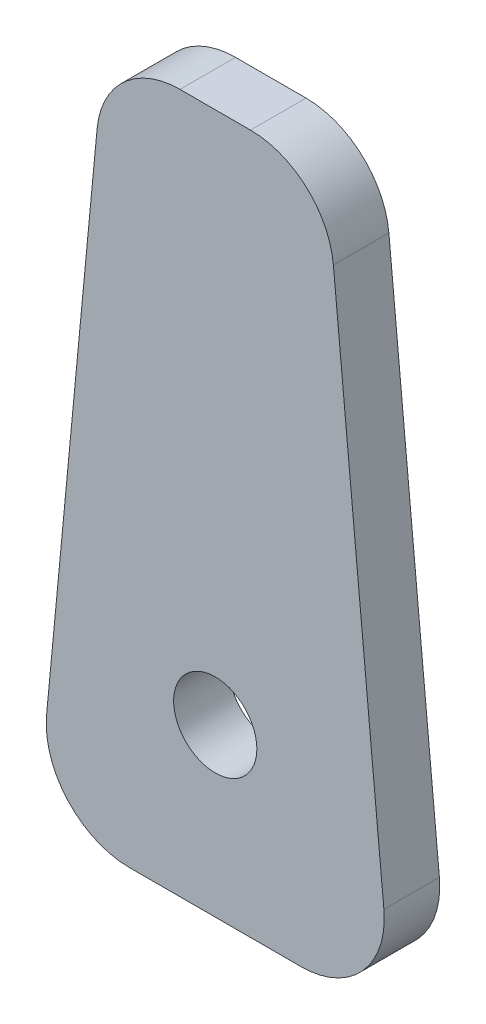
ISO-10303-21;
HEADER;
FILE_DESCRIPTION(('STEP AP214'),'2;1');
FILE_NAME('part.step','',(''),(''),'','','');
FILE_SCHEMA(('AUTOMOTIVE_DESIGN { 1 0 10303 214 1 1 1 1 }'));
ENDSEC;
DATA;
#1=APPLICATION_CONTEXT('core data for automotive mechanical design processes');
#2=APPLICATION_PROTOCOL_DEFINITION('international standard','automotive_design',2000,#1);
#3=PRODUCT_CONTEXT('',#1,'mechanical');
#4=PRODUCT('Part','Part','',(#3));
#5=PRODUCT_RELATED_PRODUCT_CATEGORY('part','',(#4));
#6=PRODUCT_DEFINITION_FORMATION('','',#4);
#7=PRODUCT_DEFINITION_CONTEXT('part definition',#1,'design');
#8=PRODUCT_DEFINITION('design','',#6,#7);
#9=PRODUCT_DEFINITION_SHAPE('','',#8);
#10=(LENGTH_UNIT() NAMED_UNIT(*) SI_UNIT(.MILLI.,.METRE.));
#11=(NAMED_UNIT(*) PLANE_ANGLE_UNIT() SI_UNIT($,.RADIAN.));
#12=(NAMED_UNIT(*) SI_UNIT($,.STERADIAN.) SOLID_ANGLE_UNIT());
#13=UNCERTAINTY_MEASURE_WITH_UNIT(LENGTH_MEASURE(1.E-05),#10,'distance_accuracy_value','');
#14=(GEOMETRIC_REPRESENTATION_CONTEXT(3) GLOBAL_UNCERTAINTY_ASSIGNED_CONTEXT((#13)) GLOBAL_UNIT_ASSIGNED_CONTEXT((#10,
#11,#12)) REPRESENTATION_CONTEXT('',''));
#15=CARTESIAN_POINT('',(0.,0.,0.));
#16=DIRECTION('',(0.,0.,1.));
#17=DIRECTION('',(1.,0.,0.));
#18=AXIS2_PLACEMENT_3D('',#15,#16,#17);
#19=CARTESIAN_POINT('',(21.7947485439563,179.3875,3.175));
#20=DIRECTION('',(0.,0.,1.));
#21=DIRECTION('',(1.,0.,0.));
#22=AXIS2_PLACEMENT_3D('',#19,#20,#21);
#23=PLANE('',#22);
#24=CARTESIAN_POINT('',(21.7947485439563,179.3875,3.175));
#25=DIRECTION('',(0.,0.,1.));
#26=DIRECTION('',(1.,0.,0.));
#27=AXIS2_PLACEMENT_3D('',#24,#25,#26);
#28=CIRCLE('',#27,4.7625);
#29=CARTESIAN_POINT('',(21.7947485439564,184.15,3.175));
#30=VERTEX_POINT('',#29);
#31=CARTESIAN_POINT('',(17.0535180506606,179.83709944333,3.175));
#32=VERTEX_POINT('',#31);
#33=EDGE_CURVE('E145',#30,#32,#28,.T.);
#34=ORIENTED_EDGE('',*,*,#33,.T.);
#35=DIRECTION('',(-0.0944040825889281,-0.995533961846879,0.));
#36=VECTOR('',#35,1.);
#37=CARTESIAN_POINT('',(17.0535180506606,179.83709944333,3.175));
#38=LINE('',#37,#36);
#39=CARTESIAN_POINT('',(14.1631732230744,149.35709944333,3.175));
#40=VERTEX_POINT('',#39);
#41=EDGE_CURVE('E93',#32,#40,#38,.T.);
#42=ORIENTED_EDGE('',*,*,#41,.T.);
#43=CARTESIAN_POINT('',(18.9044037163701,148.9075,3.175));
#44=DIRECTION('',(0.,0.,1.));
#45=DIRECTION('',(-1.,0.,0.));
#46=AXIS2_PLACEMENT_3D('',#43,#44,#45);
#47=CIRCLE('',#46,4.7625);
#48=CARTESIAN_POINT('',(18.9044037163702,144.145,3.175));
#49=VERTEX_POINT('',#48);
#50=EDGE_CURVE('E160',#40,#49,#47,.T.);
#51=ORIENTED_EDGE('',*,*,#50,.T.);
#52=DIRECTION('',(1.,0.,0.));
#53=VECTOR('',#52,1.);
#54=CARTESIAN_POINT('',(18.9044037163702,144.145,3.175));
#55=LINE('',#54,#53);
#56=CARTESIAN_POINT('',(28.7205962836298,144.145,3.175));
#57=VERTEX_POINT('',#56);
#58=EDGE_CURVE('E173',#49,#57,#55,.T.);
#59=ORIENTED_EDGE('',*,*,#58,.T.);
#60=CARTESIAN_POINT('',(28.7205962836299,148.9075,3.175));
#61=DIRECTION('',(0.,0.,1.));
#62=DIRECTION('',(1.,0.,0.));
#63=AXIS2_PLACEMENT_3D('',#60,#61,#62);
#64=CIRCLE('',#63,4.7625);
#65=CARTESIAN_POINT('',(33.4618267769256,149.35709944333,3.175));
#66=VERTEX_POINT('',#65);
#67=EDGE_CURVE('E112',#57,#66,#64,.T.);
#68=ORIENTED_EDGE('',*,*,#67,.T.);
#69=DIRECTION('',(-0.0944040825889284,0.995533961846879,0.));
#70=VECTOR('',#69,1.);
#71=CARTESIAN_POINT('',(33.4618267769256,149.35709944333,3.175));
#72=LINE('',#71,#70);
#73=CARTESIAN_POINT('',(30.5714819493394,179.83709944333,3.175));
#74=VERTEX_POINT('',#73);
#75=EDGE_CURVE('E106',#66,#74,#72,.T.);
#76=ORIENTED_EDGE('',*,*,#75,.T.);
#77=CARTESIAN_POINT('',(25.8302514560437,179.3875,3.175));
#78=DIRECTION('',(0.,0.,1.));
#79=DIRECTION('',(1.,0.,0.));
#80=AXIS2_PLACEMENT_3D('',#77,#78,#79);
#81=CIRCLE('',#80,4.7625);
#82=CARTESIAN_POINT('',(25.8302514560436,184.15,3.175));
#83=VERTEX_POINT('',#82);
#84=EDGE_CURVE('E110',#74,#83,#81,.T.);
#85=ORIENTED_EDGE('',*,*,#84,.T.);
#86=DIRECTION('',(-1.,0.,0.));
#87=VECTOR('',#86,1.);
#88=CARTESIAN_POINT('',(25.8302514560436,184.15,3.175));
#89=LINE('',#88,#87);
#90=EDGE_CURVE('E50',#83,#30,#89,.T.);
#91=ORIENTED_EDGE('',*,*,#90,.T.);
#92=EDGE_LOOP('',(#34,#42,#51,#59,#68,#76,#85,#91));
#93=FACE_BOUND('',#92,.T.);
#94=CARTESIAN_POINT('',(23.8124999999996,153.67,3.175));
#95=DIRECTION('',(0.,0.,1.));
#96=DIRECTION('',(1.,0.,0.));
#97=AXIS2_PLACEMENT_3D('',#94,#95,#96);
#98=CIRCLE('',#97,2.38125000000001);
#99=CARTESIAN_POINT('',(26.1937499999996,153.67,3.175));
#100=VERTEX_POINT('',#99);
#101=EDGE_CURVE('E134',#100,#100,#98,.T.);
#102=ORIENTED_EDGE('',*,*,#101,.F.);
#103=EDGE_LOOP('',(#102));
#104=FACE_BOUND('',#103,.T.);
#105=ADVANCED_FACE('F33',(#93,#104),#23,.T.);
#106=CARTESIAN_POINT('',(21.7947485439563,179.3875,0.));
#107=DIRECTION('',(0.,0.,1.));
#108=DIRECTION('',(1.,0.,0.));
#109=AXIS2_PLACEMENT_3D('',#106,#107,#108);
#110=PLANE('',#109);
#111=CARTESIAN_POINT('',(21.7947485439563,179.3875,0.));
#112=DIRECTION('',(0.,0.,1.));
#113=DIRECTION('',(1.,0.,0.));
#114=AXIS2_PLACEMENT_3D('',#111,#112,#113);
#115=CIRCLE('',#114,4.7625);
#116=CARTESIAN_POINT('',(21.7947485439564,184.15,0.));
#117=VERTEX_POINT('',#116);
#118=CARTESIAN_POINT('',(17.0535180506606,179.83709944333,0.));
#119=VERTEX_POINT('',#118);
#120=EDGE_CURVE('E130',#117,#119,#115,.T.);
#121=ORIENTED_EDGE('',*,*,#120,.F.);
#122=DIRECTION('',(-1.,0.,0.));
#123=VECTOR('',#122,1.);
#124=CARTESIAN_POINT('',(25.8302514560436,184.15,0.));
#125=LINE('',#124,#123);
#126=CARTESIAN_POINT('',(25.8302514560436,184.15,0.));
#127=VERTEX_POINT('',#126);
#128=EDGE_CURVE('E85',#127,#117,#125,.T.);
#129=ORIENTED_EDGE('',*,*,#128,.F.);
#130=CARTESIAN_POINT('',(25.8302514560437,179.3875,0.));
#131=DIRECTION('',(0.,0.,1.));
#132=DIRECTION('',(1.,0.,0.));
#133=AXIS2_PLACEMENT_3D('',#130,#131,#132);
#134=CIRCLE('',#133,4.7625);
#135=CARTESIAN_POINT('',(30.5714819493394,179.83709944333,0.));
#136=VERTEX_POINT('',#135);
#137=EDGE_CURVE('E79',#136,#127,#134,.T.);
#138=ORIENTED_EDGE('',*,*,#137,.F.);
#139=DIRECTION('',(-0.0944040825889284,0.995533961846879,0.));
#140=VECTOR('',#139,1.);
#141=CARTESIAN_POINT('',(33.4618267769256,149.35709944333,0.));
#142=LINE('',#141,#140);
#143=CARTESIAN_POINT('',(33.4618267769256,149.35709944333,0.));
#144=VERTEX_POINT('',#143);
#145=EDGE_CURVE('E120',#144,#136,#142,.T.);
#146=ORIENTED_EDGE('',*,*,#145,.F.);
#147=CARTESIAN_POINT('',(28.7205962836299,148.9075,0.));
#148=DIRECTION('',(0.,0.,1.));
#149=DIRECTION('',(1.,0.,0.));
#150=AXIS2_PLACEMENT_3D('',#147,#148,#149);
#151=CIRCLE('',#150,4.7625);
#152=CARTESIAN_POINT('',(28.7205962836298,144.145,0.));
#153=VERTEX_POINT('',#152);
#154=EDGE_CURVE('E140',#153,#144,#151,.T.);
#155=ORIENTED_EDGE('',*,*,#154,.F.);
#156=DIRECTION('',(1.,0.,0.));
#157=VECTOR('',#156,1.);
#158=CARTESIAN_POINT('',(18.9044037163702,144.145,0.));
#159=LINE('',#158,#157);
#160=CARTESIAN_POINT('',(18.9044037163702,144.145,0.));
#161=VERTEX_POINT('',#160);
#162=EDGE_CURVE('E138',#161,#153,#159,.T.);
#163=ORIENTED_EDGE('',*,*,#162,.F.);
#164=CARTESIAN_POINT('',(18.9044037163701,148.9075,0.));
#165=DIRECTION('',(0.,0.,1.));
#166=DIRECTION('',(-1.,0.,0.));
#167=AXIS2_PLACEMENT_3D('',#164,#165,#166);
#168=CIRCLE('',#167,4.7625);
#169=CARTESIAN_POINT('',(14.1631732230744,149.35709944333,0.));
#170=VERTEX_POINT('',#169);
#171=EDGE_CURVE('E136',#170,#161,#168,.T.);
#172=ORIENTED_EDGE('',*,*,#171,.F.);
#173=DIRECTION('',(-0.0944040825889281,-0.995533961846879,0.));
#174=VECTOR('',#173,1.);
#175=CARTESIAN_POINT('',(17.0535180506606,179.83709944333,0.));
#176=LINE('',#175,#174);
#177=EDGE_CURVE('E133',#119,#170,#176,.T.);
#178=ORIENTED_EDGE('',*,*,#177,.F.);
#179=EDGE_LOOP('',(#121,#129,#138,#146,#155,#163,#172,#178));
#180=FACE_BOUND('',#179,.T.);
#181=CARTESIAN_POINT('',(23.8124999999996,153.67,0.));
#182=DIRECTION('',(0.,0.,1.));
#183=DIRECTION('',(1.,0.,0.));
#184=AXIS2_PLACEMENT_3D('',#181,#182,#183);
#185=CIRCLE('',#184,2.38125000000001);
#186=CARTESIAN_POINT('',(26.1937499999996,153.67,0.));
#187=VERTEX_POINT('',#186);
#188=EDGE_CURVE('E179',#187,#187,#185,.T.);
#189=ORIENTED_EDGE('',*,*,#188,.T.);
#190=EDGE_LOOP('',(#189));
#191=FACE_BOUND('',#190,.T.);
#192=ADVANCED_FACE('F164',(#180,#191),#110,.F.);
#193=CARTESIAN_POINT('',(21.7947485439563,179.3875,3.175));
#194=DIRECTION('',(0.,0.,-1.));
#195=DIRECTION('',(-1.,0.,0.));
#196=AXIS2_PLACEMENT_3D('',#193,#194,#195);
#197=CYLINDRICAL_SURFACE('',#196,4.7625);
#198=ORIENTED_EDGE('',*,*,#120,.T.);
#199=DIRECTION('',(0.,0.,-1.));
#200=VECTOR('',#199,1.);
#201=CARTESIAN_POINT('',(17.0535180506606,179.83709944333,3.175));
#202=LINE('',#201,#200);
#203=EDGE_CURVE('E11',#32,#119,#202,.T.);
#204=ORIENTED_EDGE('',*,*,#203,.F.);
#205=ORIENTED_EDGE('',*,*,#33,.F.);
#206=DIRECTION('',(0.,0.,-1.));
#207=VECTOR('',#206,1.);
#208=CARTESIAN_POINT('',(21.7947485439564,184.15,3.175));
#209=LINE('',#208,#207);
#210=EDGE_CURVE('E126',#30,#117,#209,.T.);
#211=ORIENTED_EDGE('',*,*,#210,.T.);
#212=EDGE_LOOP('',(#198,#204,#205,#211));
#213=FACE_BOUND('',#212,.T.);
#214=ADVANCED_FACE('F35',(#213),#197,.T.);
#215=CARTESIAN_POINT('',(17.0535180506606,179.83709944333,3.175));
#216=DIRECTION('',(0.995533961846879,-0.0944040825889281,0.));
#217=DIRECTION('',(0.0944040825889281,0.995533961846879,0.));
#218=AXIS2_PLACEMENT_3D('',#215,#216,#217);
#219=PLANE('',#218);
#220=ORIENTED_EDGE('',*,*,#177,.T.);
#221=DIRECTION('',(0.,0.,-1.));
#222=VECTOR('',#221,1.);
#223=CARTESIAN_POINT('',(14.1631732230744,149.35709944333,3.175));
#224=LINE('',#223,#222);
#225=EDGE_CURVE('E42',#40,#170,#224,.T.);
#226=ORIENTED_EDGE('',*,*,#225,.F.);
#227=ORIENTED_EDGE('',*,*,#41,.F.);
#228=ORIENTED_EDGE('',*,*,#203,.T.);
#229=EDGE_LOOP('',(#220,#226,#227,#228));
#230=FACE_BOUND('',#229,.T.);
#231=ADVANCED_FACE('F207',(#230),#219,.F.);
#232=CARTESIAN_POINT('',(18.9044037163701,148.9075,3.175));
#233=DIRECTION('',(0.,0.,-1.));
#234=DIRECTION('',(-1.,0.,0.));
#235=AXIS2_PLACEMENT_3D('',#232,#233,#234);
#236=CYLINDRICAL_SURFACE('',#235,4.7625);
#237=ORIENTED_EDGE('',*,*,#171,.T.);
#238=DIRECTION('',(0.,0.,-1.));
#239=VECTOR('',#238,1.);
#240=CARTESIAN_POINT('',(18.9044037163702,144.145,3.175));
#241=LINE('',#240,#239);
#242=EDGE_CURVE('E152',#49,#161,#241,.T.);
#243=ORIENTED_EDGE('',*,*,#242,.F.);
#244=ORIENTED_EDGE('',*,*,#50,.F.);
#245=ORIENTED_EDGE('',*,*,#225,.T.);
#246=EDGE_LOOP('',(#237,#243,#244,#245));
#247=FACE_BOUND('',#246,.T.);
#248=ADVANCED_FACE('F158',(#247),#236,.T.);
#249=CARTESIAN_POINT('',(18.9044037163702,144.145,3.175));
#250=DIRECTION('',(0.,1.,0.));
#251=DIRECTION('',(0.,0.,1.));
#252=AXIS2_PLACEMENT_3D('',#249,#250,#251);
#253=PLANE('',#252);
#254=ORIENTED_EDGE('',*,*,#162,.T.);
#255=DIRECTION('',(0.,0.,-1.));
#256=VECTOR('',#255,1.);
#257=CARTESIAN_POINT('',(28.7205962836298,144.145,3.175));
#258=LINE('',#257,#256);
#259=EDGE_CURVE('E149',#57,#153,#258,.T.);
#260=ORIENTED_EDGE('',*,*,#259,.F.);
#261=ORIENTED_EDGE('',*,*,#58,.F.);
#262=ORIENTED_EDGE('',*,*,#242,.T.);
#263=EDGE_LOOP('',(#254,#260,#261,#262));
#264=FACE_BOUND('',#263,.T.);
#265=ADVANCED_FACE('F169',(#264),#253,.F.);
#266=CARTESIAN_POINT('',(28.7205962836299,148.9075,3.175));
#267=DIRECTION('',(0.,0.,-1.));
#268=DIRECTION('',(-1.,0.,0.));
#269=AXIS2_PLACEMENT_3D('',#266,#267,#268);
#270=CYLINDRICAL_SURFACE('',#269,4.7625);
#271=ORIENTED_EDGE('',*,*,#154,.T.);
#272=DIRECTION('',(0.,0.,-1.));
#273=VECTOR('',#272,1.);
#274=CARTESIAN_POINT('',(33.4618267769256,149.35709944333,3.175));
#275=LINE('',#274,#273);
#276=EDGE_CURVE('E121',#66,#144,#275,.T.);
#277=ORIENTED_EDGE('',*,*,#276,.F.);
#278=ORIENTED_EDGE('',*,*,#67,.F.);
#279=ORIENTED_EDGE('',*,*,#259,.T.);
#280=EDGE_LOOP('',(#271,#277,#278,#279));
#281=FACE_BOUND('',#280,.T.);
#282=ADVANCED_FACE('F172',(#281),#270,.T.);
#283=CARTESIAN_POINT('',(33.4618267769256,149.35709944333,3.175));
#284=DIRECTION('',(-0.995533961846879,-0.0944040825889284,0.));
#285=DIRECTION('',(0.0944040825889284,-0.995533961846879,0.));
#286=AXIS2_PLACEMENT_3D('',#283,#284,#285);
#287=PLANE('',#286);
#288=ORIENTED_EDGE('',*,*,#145,.T.);
#289=DIRECTION('',(0.,0.,-1.));
#290=VECTOR('',#289,1.);
#291=CARTESIAN_POINT('',(30.5714819493394,179.83709944333,3.175));
#292=LINE('',#291,#290);
#293=EDGE_CURVE('E117',#74,#136,#292,.T.);
#294=ORIENTED_EDGE('',*,*,#293,.F.);
#295=ORIENTED_EDGE('',*,*,#75,.F.);
#296=ORIENTED_EDGE('',*,*,#276,.T.);
#297=EDGE_LOOP('',(#288,#294,#295,#296));
#298=FACE_BOUND('',#297,.T.);
#299=ADVANCED_FACE('F118',(#298),#287,.F.);
#300=CARTESIAN_POINT('',(25.8302514560437,179.3875,3.175));
#301=DIRECTION('',(0.,0.,-1.));
#302=DIRECTION('',(-1.,0.,0.));
#303=AXIS2_PLACEMENT_3D('',#300,#301,#302);
#304=CYLINDRICAL_SURFACE('',#303,4.7625);
#305=ORIENTED_EDGE('',*,*,#137,.T.);
#306=DIRECTION('',(0.,0.,-1.));
#307=VECTOR('',#306,1.);
#308=CARTESIAN_POINT('',(25.8302514560436,184.15,3.175));
#309=LINE('',#308,#307);
#310=EDGE_CURVE('E122',#83,#127,#309,.T.);
#311=ORIENTED_EDGE('',*,*,#310,.F.);
#312=ORIENTED_EDGE('',*,*,#84,.F.);
#313=ORIENTED_EDGE('',*,*,#293,.T.);
#314=EDGE_LOOP('',(#305,#311,#312,#313));
#315=FACE_BOUND('',#314,.T.);
#316=ADVANCED_FACE('F124',(#315),#304,.T.);
#317=CARTESIAN_POINT('',(25.8302514560436,184.15,3.175));
#318=DIRECTION('',(0.,-1.,0.));
#319=DIRECTION('',(0.,0.,-1.));
#320=AXIS2_PLACEMENT_3D('',#317,#318,#319);
#321=PLANE('',#320);
#322=ORIENTED_EDGE('',*,*,#128,.T.);
#323=ORIENTED_EDGE('',*,*,#210,.F.);
#324=ORIENTED_EDGE('',*,*,#90,.F.);
#325=ORIENTED_EDGE('',*,*,#310,.T.);
#326=EDGE_LOOP('',(#322,#323,#324,#325));
#327=FACE_BOUND('',#326,.T.);
#328=ADVANCED_FACE('F195',(#327),#321,.F.);
#329=CARTESIAN_POINT('',(23.8124999999996,153.67,3.175));
#330=DIRECTION('',(0.,0.,-1.));
#331=DIRECTION('',(-1.,0.,0.));
#332=AXIS2_PLACEMENT_3D('',#329,#330,#331);
#333=CYLINDRICAL_SURFACE('',#332,2.38125000000001);
#334=ORIENTED_EDGE('',*,*,#101,.T.);
#335=EDGE_LOOP('',(#334));
#336=FACE_BOUND('',#335,.T.);
#337=ORIENTED_EDGE('',*,*,#188,.F.);
#338=EDGE_LOOP('',(#337));
#339=FACE_BOUND('',#338,.T.);
#340=ADVANCED_FACE('F185',(#336,#339),#333,.F.);
#341=CLOSED_SHELL('',(#105,#192,#214,#231,#248,#265,#282,#299,#316,#328,#340));
#342=MANIFOLD_SOLID_BREP('B2',#341);
#343=ADVANCED_BREP_SHAPE_REPRESENTATION('',(#18,#342),#14);
#344=SHAPE_DEFINITION_REPRESENTATION(#9,#343);
ENDSEC;
END-ISO-10303-21;
